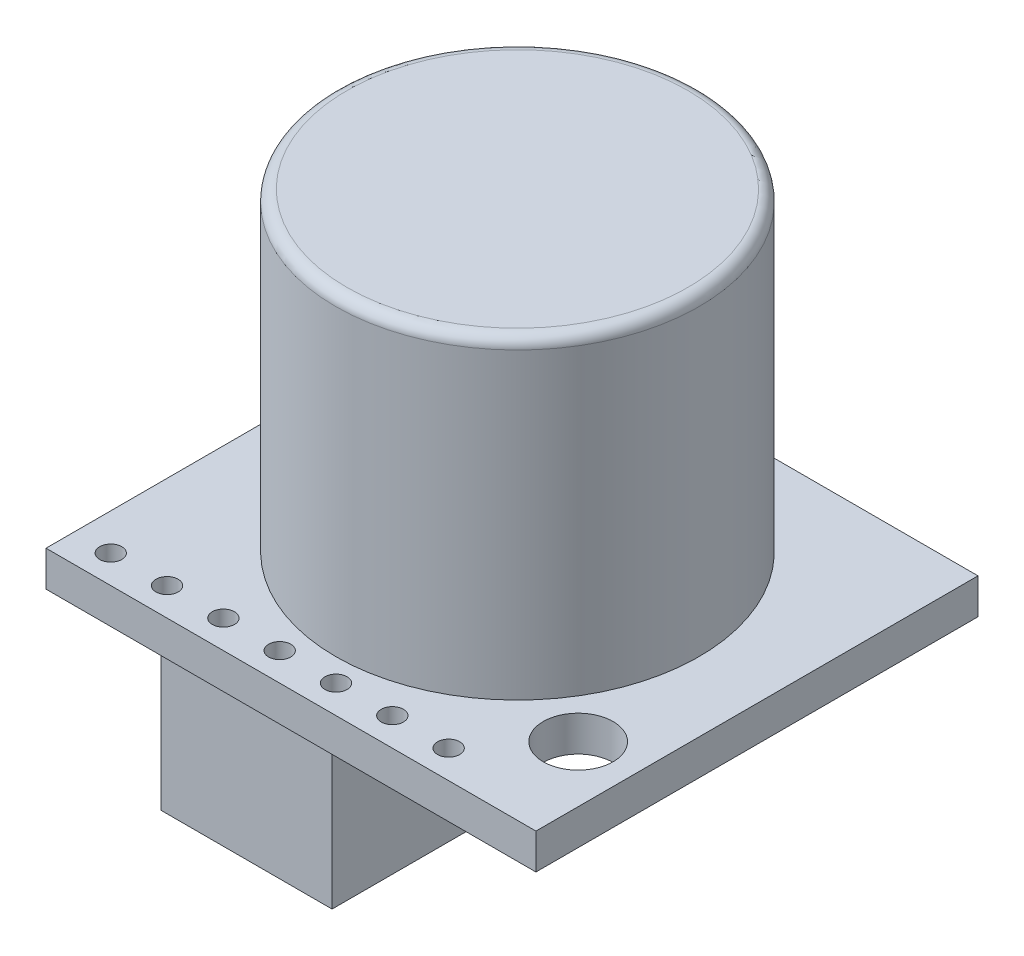
ISO-10303-21;
HEADER;
FILE_DESCRIPTION(('STEP AP214'),'2;1');
FILE_NAME('part.step','',(''),(''),'','','');
FILE_SCHEMA(('AUTOMOTIVE_DESIGN { 1 0 10303 214 1 1 1 1 }'));
ENDSEC;
DATA;
#1=APPLICATION_CONTEXT('core data for automotive mechanical design processes');
#2=APPLICATION_PROTOCOL_DEFINITION('international standard','automotive_design',2000,#1);
#3=PRODUCT_CONTEXT('',#1,'mechanical');
#4=PRODUCT('Part','Part','',(#3));
#5=PRODUCT_RELATED_PRODUCT_CATEGORY('part','',(#4));
#6=PRODUCT_DEFINITION_FORMATION('','',#4);
#7=PRODUCT_DEFINITION_CONTEXT('part definition',#1,'design');
#8=PRODUCT_DEFINITION('design','',#6,#7);
#9=PRODUCT_DEFINITION_SHAPE('','',#8);
#10=(LENGTH_UNIT() NAMED_UNIT(*) SI_UNIT(.MILLI.,.METRE.));
#11=(NAMED_UNIT(*) PLANE_ANGLE_UNIT() SI_UNIT($,.RADIAN.));
#12=(NAMED_UNIT(*) SI_UNIT($,.STERADIAN.) SOLID_ANGLE_UNIT());
#13=UNCERTAINTY_MEASURE_WITH_UNIT(LENGTH_MEASURE(1.E-05),#10,'distance_accuracy_value','');
#14=(GEOMETRIC_REPRESENTATION_CONTEXT(3) GLOBAL_UNCERTAINTY_ASSIGNED_CONTEXT((#13)) GLOBAL_UNIT_ASSIGNED_CONTEXT((#10,
#11,#12)) REPRESENTATION_CONTEXT('',''));
#15=CARTESIAN_POINT('',(0.,0.,0.));
#16=DIRECTION('',(0.,0.,1.));
#17=DIRECTION('',(1.,0.,0.));
#18=AXIS2_PLACEMENT_3D('',#15,#16,#17);
#19=CARTESIAN_POINT('',(0.,1.6002,0.));
#20=DIRECTION('',(0.,1.,0.));
#21=DIRECTION('',(0.,0.,1.));
#22=AXIS2_PLACEMENT_3D('',#19,#20,#21);
#23=PLANE('',#22);
#24=DIRECTION('',(1.,0.,0.));
#25=VECTOR('',#24,1.);
#26=CARTESIAN_POINT('',(0.,1.6002,0.));
#27=LINE('',#26,#25);
#28=CARTESIAN_POINT('',(0.,1.6002,0.));
#29=VERTEX_POINT('',#28);
#30=CARTESIAN_POINT('',(22.098,1.6002,0.));
#31=VERTEX_POINT('',#30);
#32=EDGE_CURVE('E166',#29,#31,#27,.T.);
#33=ORIENTED_EDGE('',*,*,#32,.T.);
#34=DIRECTION('',(0.,0.,-1.));
#35=VECTOR('',#34,1.);
#36=CARTESIAN_POINT('',(22.098,1.6002,0.));
#37=LINE('',#36,#35);
#38=CARTESIAN_POINT('',(22.098,1.6002,-19.939));
#39=VERTEX_POINT('',#38);
#40=EDGE_CURVE('E169',#31,#39,#37,.T.);
#41=ORIENTED_EDGE('',*,*,#40,.T.);
#42=DIRECTION('',(1.,0.,0.));
#43=VECTOR('',#42,1.);
#44=CARTESIAN_POINT('',(0.,1.6002,-19.939));
#45=LINE('',#44,#43);
#46=CARTESIAN_POINT('',(0.,1.6002,-19.939));
#47=VERTEX_POINT('',#46);
#48=EDGE_CURVE('E171',#47,#39,#45,.T.);
#49=ORIENTED_EDGE('',*,*,#48,.F.);
#50=DIRECTION('',(0.,0.,-1.));
#51=VECTOR('',#50,1.);
#52=CARTESIAN_POINT('',(0.,1.6002,0.));
#53=LINE('',#52,#51);
#54=EDGE_CURVE('E174',#29,#47,#53,.T.);
#55=ORIENTED_EDGE('',*,*,#54,.F.);
#56=EDGE_LOOP('',(#33,#41,#49,#55));
#57=FACE_BOUND('',#56,.T.);
#58=CARTESIAN_POINT('',(2.54,1.6002,-17.399));
#59=DIRECTION('',(0.,1.,0.));
#60=DIRECTION('',(0.,0.,1.));
#61=AXIS2_PLACEMENT_3D('',#58,#59,#60);
#62=CIRCLE('',#61,1.5748);
#63=CARTESIAN_POINT('',(2.54,1.6002,-15.8242));
#64=VERTEX_POINT('',#63);
#65=EDGE_CURVE('E163',#64,#64,#62,.T.);
#66=ORIENTED_EDGE('',*,*,#65,.F.);
#67=EDGE_LOOP('',(#66));
#68=FACE_BOUND('',#67,.T.);
#69=CARTESIAN_POINT('',(19.558,1.6002,-4.445));
#70=DIRECTION('',(0.,1.,0.));
#71=DIRECTION('',(0.,0.,1.));
#72=AXIS2_PLACEMENT_3D('',#69,#70,#71);
#73=CIRCLE('',#72,1.5748);
#74=CARTESIAN_POINT('',(19.558,1.6002,-2.8702));
#75=VERTEX_POINT('',#74);
#76=EDGE_CURVE('E160',#75,#75,#73,.T.);
#77=ORIENTED_EDGE('',*,*,#76,.F.);
#78=EDGE_LOOP('',(#77));
#79=FACE_BOUND('',#78,.T.);
#80=CARTESIAN_POINT('',(1.651,1.6002,-1.27));
#81=DIRECTION('',(0.,1.,0.));
#82=DIRECTION('',(0.,0.,1.));
#83=AXIS2_PLACEMENT_3D('',#80,#81,#82);
#84=CIRCLE('',#83,0.5);
#85=CARTESIAN_POINT('',(1.651,1.6002,-0.770000000000004));
#86=VERTEX_POINT('',#85);
#87=EDGE_CURVE('E157',#86,#86,#84,.T.);
#88=ORIENTED_EDGE('',*,*,#87,.F.);
#89=EDGE_LOOP('',(#88));
#90=FACE_BOUND('',#89,.T.);
#91=CARTESIAN_POINT('',(4.191,1.6002,-1.27));
#92=DIRECTION('',(0.,1.,0.));
#93=DIRECTION('',(0.,0.,1.));
#94=AXIS2_PLACEMENT_3D('',#91,#92,#93);
#95=CIRCLE('',#94,0.500000000000001);
#96=CARTESIAN_POINT('',(4.191,1.6002,-0.770000000000003));
#97=VERTEX_POINT('',#96);
#98=EDGE_CURVE('E154',#97,#97,#95,.T.);
#99=ORIENTED_EDGE('',*,*,#98,.F.);
#100=EDGE_LOOP('',(#99));
#101=FACE_BOUND('',#100,.T.);
#102=CARTESIAN_POINT('',(6.731,1.6002,-1.27));
#103=DIRECTION('',(0.,1.,0.));
#104=DIRECTION('',(0.,0.,1.));
#105=AXIS2_PLACEMENT_3D('',#102,#103,#104);
#106=CIRCLE('',#105,0.500000000000001);
#107=CARTESIAN_POINT('',(6.731,1.6002,-0.770000000000003));
#108=VERTEX_POINT('',#107);
#109=EDGE_CURVE('E151',#108,#108,#106,.T.);
#110=ORIENTED_EDGE('',*,*,#109,.F.);
#111=EDGE_LOOP('',(#110));
#112=FACE_BOUND('',#111,.T.);
#113=CARTESIAN_POINT('',(9.271,1.6002,-1.27));
#114=DIRECTION('',(0.,1.,0.));
#115=DIRECTION('',(0.,0.,1.));
#116=AXIS2_PLACEMENT_3D('',#113,#114,#115);
#117=CIRCLE('',#116,0.500000000000001);
#118=CARTESIAN_POINT('',(9.271,1.6002,-0.770000000000003));
#119=VERTEX_POINT('',#118);
#120=EDGE_CURVE('E148',#119,#119,#117,.T.);
#121=ORIENTED_EDGE('',*,*,#120,.F.);
#122=EDGE_LOOP('',(#121));
#123=FACE_BOUND('',#122,.T.);
#124=CARTESIAN_POINT('',(11.811,1.6002,-1.27));
#125=DIRECTION('',(0.,1.,0.));
#126=DIRECTION('',(0.,0.,1.));
#127=AXIS2_PLACEMENT_3D('',#124,#125,#126);
#128=CIRCLE('',#127,0.500000000000001);
#129=CARTESIAN_POINT('',(11.811,1.6002,-0.770000000000003));
#130=VERTEX_POINT('',#129);
#131=EDGE_CURVE('E145',#130,#130,#128,.T.);
#132=ORIENTED_EDGE('',*,*,#131,.F.);
#133=EDGE_LOOP('',(#132));
#134=FACE_BOUND('',#133,.T.);
#135=CARTESIAN_POINT('',(14.351,1.6002,-1.27));
#136=DIRECTION('',(0.,1.,0.));
#137=DIRECTION('',(0.,0.,1.));
#138=AXIS2_PLACEMENT_3D('',#135,#136,#137);
#139=CIRCLE('',#138,0.500000000000001);
#140=CARTESIAN_POINT('',(14.351,1.6002,-0.770000000000003));
#141=VERTEX_POINT('',#140);
#142=EDGE_CURVE('E141',#141,#141,#139,.T.);
#143=ORIENTED_EDGE('',*,*,#142,.F.);
#144=EDGE_LOOP('',(#143));
#145=FACE_BOUND('',#144,.T.);
#146=CARTESIAN_POINT('',(16.891,1.6002,-1.27));
#147=DIRECTION('',(0.,1.,0.));
#148=DIRECTION('',(0.,0.,1.));
#149=AXIS2_PLACEMENT_3D('',#146,#147,#148);
#150=CIRCLE('',#149,0.499999999999999);
#151=CARTESIAN_POINT('',(16.891,1.6002,-0.770000000000005));
#152=VERTEX_POINT('',#151);
#153=EDGE_CURVE('E138',#152,#152,#150,.T.);
#154=ORIENTED_EDGE('',*,*,#153,.F.);
#155=EDGE_LOOP('',(#154));
#156=FACE_BOUND('',#155,.T.);
#157=CARTESIAN_POINT('',(10.7741203925044,1.6002,-10.4902));
#158=DIRECTION('',(0.,1.,0.));
#159=DIRECTION('',(0.,0.,1.));
#160=AXIS2_PLACEMENT_3D('',#157,#158,#159);
#161=CIRCLE('',#160,8.1915);
#162=CARTESIAN_POINT('',(10.7741203925044,1.6002,-2.2987));
#163=VERTEX_POINT('',#162);
#164=EDGE_CURVE('E125',#163,#163,#161,.F.);
#165=ORIENTED_EDGE('',*,*,#164,.T.);
#166=EDGE_LOOP('',(#165));
#167=FACE_BOUND('',#166,.T.);
#168=ADVANCED_FACE('F33',(#57,#68,#79,#90,#101,#112,#123,#134,#145,#156,#167),#23,.T.);
#169=CARTESIAN_POINT('',(0.,1.6002,0.));
#170=DIRECTION('',(0.,0.,-1.));
#171=DIRECTION('',(-1.,0.,0.));
#172=AXIS2_PLACEMENT_3D('',#169,#170,#171);
#173=PLANE('',#172);
#174=DIRECTION('',(1.,0.,0.));
#175=VECTOR('',#174,1.);
#176=CARTESIAN_POINT('',(0.,0.,0.));
#177=LINE('',#176,#175);
#178=CARTESIAN_POINT('',(0.,0.,0.));
#179=VERTEX_POINT('',#178);
#180=CARTESIAN_POINT('',(22.098,0.,0.));
#181=VERTEX_POINT('',#180);
#182=EDGE_CURVE('E204',#179,#181,#177,.T.);
#183=ORIENTED_EDGE('',*,*,#182,.T.);
#184=DIRECTION('',(0.,-1.,0.));
#185=VECTOR('',#184,1.);
#186=CARTESIAN_POINT('',(22.098,1.6002,0.));
#187=LINE('',#186,#185);
#188=EDGE_CURVE('E220',#31,#181,#187,.T.);
#189=ORIENTED_EDGE('',*,*,#188,.F.);
#190=ORIENTED_EDGE('',*,*,#32,.F.);
#191=DIRECTION('',(0.,-1.,0.));
#192=VECTOR('',#191,1.);
#193=CARTESIAN_POINT('',(0.,1.6002,0.));
#194=LINE('',#193,#192);
#195=EDGE_CURVE('E177',#29,#179,#194,.T.);
#196=ORIENTED_EDGE('',*,*,#195,.T.);
#197=EDGE_LOOP('',(#183,#189,#190,#196));
#198=FACE_BOUND('',#197,.T.);
#199=ADVANCED_FACE('F236',(#198),#173,.F.);
#200=CARTESIAN_POINT('',(22.098,1.6002,0.));
#201=DIRECTION('',(-1.,0.,0.));
#202=DIRECTION('',(0.,0.,1.));
#203=AXIS2_PLACEMENT_3D('',#200,#201,#202);
#204=PLANE('',#203);
#205=DIRECTION('',(0.,0.,-1.));
#206=VECTOR('',#205,1.);
#207=CARTESIAN_POINT('',(22.098,0.,0.));
#208=LINE('',#207,#206);
#209=CARTESIAN_POINT('',(22.098,0.,-19.939));
#210=VERTEX_POINT('',#209);
#211=EDGE_CURVE('E207',#181,#210,#208,.T.);
#212=ORIENTED_EDGE('',*,*,#211,.T.);
#213=DIRECTION('',(0.,-1.,0.));
#214=VECTOR('',#213,1.);
#215=CARTESIAN_POINT('',(22.098,1.6002,-19.939));
#216=LINE('',#215,#214);
#217=EDGE_CURVE('E218',#39,#210,#216,.T.);
#218=ORIENTED_EDGE('',*,*,#217,.F.);
#219=ORIENTED_EDGE('',*,*,#40,.F.);
#220=ORIENTED_EDGE('',*,*,#188,.T.);
#221=EDGE_LOOP('',(#212,#218,#219,#220));
#222=FACE_BOUND('',#221,.T.);
#223=ADVANCED_FACE('F242',(#222),#204,.F.);
#224=CARTESIAN_POINT('',(0.,1.6002,-19.939));
#225=DIRECTION('',(0.,0.,-1.));
#226=DIRECTION('',(-1.,0.,0.));
#227=AXIS2_PLACEMENT_3D('',#224,#225,#226);
#228=PLANE('',#227);
#229=DIRECTION('',(1.,0.,0.));
#230=VECTOR('',#229,1.);
#231=CARTESIAN_POINT('',(0.,0.,-19.939));
#232=LINE('',#231,#230);
#233=CARTESIAN_POINT('',(0.,0.,-19.939));
#234=VERTEX_POINT('',#233);
#235=EDGE_CURVE('E210',#234,#210,#232,.T.);
#236=ORIENTED_EDGE('',*,*,#235,.F.);
#237=DIRECTION('',(0.,-1.,0.));
#238=VECTOR('',#237,1.);
#239=CARTESIAN_POINT('',(0.,1.6002,-19.939));
#240=LINE('',#239,#238);
#241=EDGE_CURVE('E216',#47,#234,#240,.T.);
#242=ORIENTED_EDGE('',*,*,#241,.F.);
#243=ORIENTED_EDGE('',*,*,#48,.T.);
#244=ORIENTED_EDGE('',*,*,#217,.T.);
#245=EDGE_LOOP('',(#236,#242,#243,#244));
#246=FACE_BOUND('',#245,.T.);
#247=ADVANCED_FACE('F257',(#246),#228,.T.);
#248=CARTESIAN_POINT('',(2.54,1.6002,-17.399));
#249=DIRECTION('',(0.,-1.,0.));
#250=DIRECTION('',(0.,0.,-1.));
#251=AXIS2_PLACEMENT_3D('',#248,#249,#250);
#252=CYLINDRICAL_SURFACE('',#251,1.5748);
#253=ORIENTED_EDGE('',*,*,#65,.T.);
#254=EDGE_LOOP('',(#253));
#255=FACE_BOUND('',#254,.T.);
#256=CARTESIAN_POINT('',(2.54,0.,-17.399));
#257=DIRECTION('',(0.,1.,0.));
#258=DIRECTION('',(0.,0.,1.));
#259=AXIS2_PLACEMENT_3D('',#256,#257,#258);
#260=CIRCLE('',#259,1.5748);
#261=CARTESIAN_POINT('',(2.54,0.,-15.8242));
#262=VERTEX_POINT('',#261);
#263=EDGE_CURVE('E201',#262,#262,#260,.T.);
#264=ORIENTED_EDGE('',*,*,#263,.F.);
#265=EDGE_LOOP('',(#264));
#266=FACE_BOUND('',#265,.T.);
#267=ADVANCED_FACE('F260',(#255,#266),#252,.F.);
#268=CARTESIAN_POINT('',(19.558,1.6002,-4.445));
#269=DIRECTION('',(0.,-1.,0.));
#270=DIRECTION('',(0.,0.,-1.));
#271=AXIS2_PLACEMENT_3D('',#268,#269,#270);
#272=CYLINDRICAL_SURFACE('',#271,1.5748);
#273=ORIENTED_EDGE('',*,*,#76,.T.);
#274=EDGE_LOOP('',(#273));
#275=FACE_BOUND('',#274,.T.);
#276=CARTESIAN_POINT('',(19.558,0.,-4.445));
#277=DIRECTION('',(0.,1.,0.));
#278=DIRECTION('',(0.,0.,1.));
#279=AXIS2_PLACEMENT_3D('',#276,#277,#278);
#280=CIRCLE('',#279,1.5748);
#281=CARTESIAN_POINT('',(19.558,0.,-2.8702));
#282=VERTEX_POINT('',#281);
#283=EDGE_CURVE('E198',#282,#282,#280,.T.);
#284=ORIENTED_EDGE('',*,*,#283,.F.);
#285=EDGE_LOOP('',(#284));
#286=FACE_BOUND('',#285,.T.);
#287=ADVANCED_FACE('F267',(#275,#286),#272,.F.);
#288=CARTESIAN_POINT('',(1.651,1.6002,-1.27));
#289=DIRECTION('',(0.,-1.,0.));
#290=DIRECTION('',(0.,0.,-1.));
#291=AXIS2_PLACEMENT_3D('',#288,#289,#290);
#292=CYLINDRICAL_SURFACE('',#291,0.5);
#293=ORIENTED_EDGE('',*,*,#87,.T.);
#294=EDGE_LOOP('',(#293));
#295=FACE_BOUND('',#294,.T.);
#296=CARTESIAN_POINT('',(1.651,0.,-1.27));
#297=DIRECTION('',(0.,1.,0.));
#298=DIRECTION('',(0.,0.,1.));
#299=AXIS2_PLACEMENT_3D('',#296,#297,#298);
#300=CIRCLE('',#299,0.5);
#301=CARTESIAN_POINT('',(1.651,0.,-0.770000000000004));
#302=VERTEX_POINT('',#301);
#303=EDGE_CURVE('E195',#302,#302,#300,.T.);
#304=ORIENTED_EDGE('',*,*,#303,.F.);
#305=EDGE_LOOP('',(#304));
#306=FACE_BOUND('',#305,.T.);
#307=ADVANCED_FACE('F271',(#295,#306),#292,.F.);
#308=CARTESIAN_POINT('',(4.191,1.6002,-1.27));
#309=DIRECTION('',(0.,-1.,0.));
#310=DIRECTION('',(0.,0.,-1.));
#311=AXIS2_PLACEMENT_3D('',#308,#309,#310);
#312=CYLINDRICAL_SURFACE('',#311,0.500000000000001);
#313=ORIENTED_EDGE('',*,*,#98,.T.);
#314=EDGE_LOOP('',(#313));
#315=FACE_BOUND('',#314,.T.);
#316=CARTESIAN_POINT('',(4.191,0.,-1.27));
#317=DIRECTION('',(0.,1.,0.));
#318=DIRECTION('',(0.,0.,1.));
#319=AXIS2_PLACEMENT_3D('',#316,#317,#318);
#320=CIRCLE('',#319,0.500000000000001);
#321=CARTESIAN_POINT('',(4.191,0.,-0.770000000000003));
#322=VERTEX_POINT('',#321);
#323=EDGE_CURVE('E192',#322,#322,#320,.T.);
#324=ORIENTED_EDGE('',*,*,#323,.F.);
#325=EDGE_LOOP('',(#324));
#326=FACE_BOUND('',#325,.T.);
#327=ADVANCED_FACE('F275',(#315,#326),#312,.F.);
#328=CARTESIAN_POINT('',(6.731,1.6002,-1.27));
#329=DIRECTION('',(0.,-1.,0.));
#330=DIRECTION('',(0.,0.,-1.));
#331=AXIS2_PLACEMENT_3D('',#328,#329,#330);
#332=CYLINDRICAL_SURFACE('',#331,0.500000000000001);
#333=ORIENTED_EDGE('',*,*,#109,.T.);
#334=EDGE_LOOP('',(#333));
#335=FACE_BOUND('',#334,.T.);
#336=CARTESIAN_POINT('',(6.731,0.,-1.27));
#337=DIRECTION('',(0.,1.,0.));
#338=DIRECTION('',(0.,0.,1.));
#339=AXIS2_PLACEMENT_3D('',#336,#337,#338);
#340=CIRCLE('',#339,0.500000000000001);
#341=CARTESIAN_POINT('',(6.731,0.,-0.770000000000003));
#342=VERTEX_POINT('',#341);
#343=EDGE_CURVE('E189',#342,#342,#340,.T.);
#344=ORIENTED_EDGE('',*,*,#343,.F.);
#345=EDGE_LOOP('',(#344));
#346=FACE_BOUND('',#345,.T.);
#347=ADVANCED_FACE('F279',(#335,#346),#332,.F.);
#348=CARTESIAN_POINT('',(9.271,1.6002,-1.27));
#349=DIRECTION('',(0.,-1.,0.));
#350=DIRECTION('',(0.,0.,-1.));
#351=AXIS2_PLACEMENT_3D('',#348,#349,#350);
#352=CYLINDRICAL_SURFACE('',#351,0.500000000000001);
#353=ORIENTED_EDGE('',*,*,#120,.T.);
#354=EDGE_LOOP('',(#353));
#355=FACE_BOUND('',#354,.T.);
#356=CARTESIAN_POINT('',(9.271,0.,-1.27));
#357=DIRECTION('',(0.,1.,0.));
#358=DIRECTION('',(0.,0.,1.));
#359=AXIS2_PLACEMENT_3D('',#356,#357,#358);
#360=CIRCLE('',#359,0.500000000000001);
#361=CARTESIAN_POINT('',(9.271,0.,-0.770000000000003));
#362=VERTEX_POINT('',#361);
#363=EDGE_CURVE('E186',#362,#362,#360,.T.);
#364=ORIENTED_EDGE('',*,*,#363,.F.);
#365=EDGE_LOOP('',(#364));
#366=FACE_BOUND('',#365,.T.);
#367=ADVANCED_FACE('F283',(#355,#366),#352,.F.);
#368=CARTESIAN_POINT('',(11.811,1.6002,-1.27));
#369=DIRECTION('',(0.,-1.,0.));
#370=DIRECTION('',(0.,0.,-1.));
#371=AXIS2_PLACEMENT_3D('',#368,#369,#370);
#372=CYLINDRICAL_SURFACE('',#371,0.500000000000001);
#373=ORIENTED_EDGE('',*,*,#131,.T.);
#374=EDGE_LOOP('',(#373));
#375=FACE_BOUND('',#374,.T.);
#376=CARTESIAN_POINT('',(11.811,0.,-1.27));
#377=DIRECTION('',(0.,1.,0.));
#378=DIRECTION('',(0.,0.,1.));
#379=AXIS2_PLACEMENT_3D('',#376,#377,#378);
#380=CIRCLE('',#379,0.500000000000001);
#381=CARTESIAN_POINT('',(11.811,0.,-0.770000000000003));
#382=VERTEX_POINT('',#381);
#383=EDGE_CURVE('E183',#382,#382,#380,.T.);
#384=ORIENTED_EDGE('',*,*,#383,.F.);
#385=EDGE_LOOP('',(#384));
#386=FACE_BOUND('',#385,.T.);
#387=ADVANCED_FACE('F287',(#375,#386),#372,.F.);
#388=CARTESIAN_POINT('',(14.351,1.6002,-1.27));
#389=DIRECTION('',(0.,-1.,0.));
#390=DIRECTION('',(0.,0.,-1.));
#391=AXIS2_PLACEMENT_3D('',#388,#389,#390);
#392=CYLINDRICAL_SURFACE('',#391,0.500000000000001);
#393=ORIENTED_EDGE('',*,*,#142,.T.);
#394=EDGE_LOOP('',(#393));
#395=FACE_BOUND('',#394,.T.);
#396=CARTESIAN_POINT('',(14.351,0.,-1.27));
#397=DIRECTION('',(0.,1.,0.));
#398=DIRECTION('',(0.,0.,1.));
#399=AXIS2_PLACEMENT_3D('',#396,#397,#398);
#400=CIRCLE('',#399,0.500000000000001);
#401=CARTESIAN_POINT('',(14.351,0.,-0.770000000000003));
#402=VERTEX_POINT('',#401);
#403=EDGE_CURVE('E180',#402,#402,#400,.T.);
#404=ORIENTED_EDGE('',*,*,#403,.F.);
#405=EDGE_LOOP('',(#404));
#406=FACE_BOUND('',#405,.T.);
#407=ADVANCED_FACE('F291',(#395,#406),#392,.F.);
#408=CARTESIAN_POINT('',(16.891,1.6002,-1.27));
#409=DIRECTION('',(0.,-1.,0.));
#410=DIRECTION('',(0.,0.,-1.));
#411=AXIS2_PLACEMENT_3D('',#408,#409,#410);
#412=CYLINDRICAL_SURFACE('',#411,0.499999999999999);
#413=ORIENTED_EDGE('',*,*,#153,.T.);
#414=EDGE_LOOP('',(#413));
#415=FACE_BOUND('',#414,.T.);
#416=CARTESIAN_POINT('',(16.891,0.,-1.27));
#417=DIRECTION('',(0.,1.,0.));
#418=DIRECTION('',(0.,0.,1.));
#419=AXIS2_PLACEMENT_3D('',#416,#417,#418);
#420=CIRCLE('',#419,0.499999999999999);
#421=CARTESIAN_POINT('',(16.891,0.,-0.770000000000005));
#422=VERTEX_POINT('',#421);
#423=EDGE_CURVE('E134',#422,#422,#420,.T.);
#424=ORIENTED_EDGE('',*,*,#423,.F.);
#425=EDGE_LOOP('',(#424));
#426=FACE_BOUND('',#425,.T.);
#427=ADVANCED_FACE('F255',(#415,#426),#412,.F.);
#428=CARTESIAN_POINT('',(0.,1.6002,0.));
#429=DIRECTION('',(-1.,0.,0.));
#430=DIRECTION('',(0.,0.,1.));
#431=AXIS2_PLACEMENT_3D('',#428,#429,#430);
#432=PLANE('',#431);
#433=DIRECTION('',(0.,0.,-1.));
#434=VECTOR('',#433,1.);
#435=CARTESIAN_POINT('',(0.,0.,0.));
#436=LINE('',#435,#434);
#437=EDGE_CURVE('E142',#179,#234,#436,.T.);
#438=ORIENTED_EDGE('',*,*,#437,.F.);
#439=ORIENTED_EDGE('',*,*,#195,.F.);
#440=ORIENTED_EDGE('',*,*,#54,.T.);
#441=ORIENTED_EDGE('',*,*,#241,.T.);
#442=EDGE_LOOP('',(#438,#439,#440,#441));
#443=FACE_BOUND('',#442,.T.);
#444=ADVANCED_FACE('F252',(#443),#432,.T.);
#445=CARTESIAN_POINT('',(0.,0.,0.));
#446=DIRECTION('',(0.,1.,0.));
#447=DIRECTION('',(0.,0.,1.));
#448=AXIS2_PLACEMENT_3D('',#445,#446,#447);
#449=PLANE('',#448);
#450=DIRECTION('',(0.,0.,1.));
#451=VECTOR('',#450,1.);
#452=CARTESIAN_POINT('',(9.6012,0.,0.));
#453=LINE('',#452,#451);
#454=CARTESIAN_POINT('',(9.6012,0.,-11.0236));
#455=VERTEX_POINT('',#454);
#456=CARTESIAN_POINT('',(9.6012,0.,-3.302));
#457=VERTEX_POINT('',#456);
#458=EDGE_CURVE('E114',#455,#457,#453,.T.);
#459=ORIENTED_EDGE('',*,*,#458,.F.);
#460=DIRECTION('',(1.,0.,0.));
#461=VECTOR('',#460,1.);
#462=CARTESIAN_POINT('',(0.,0.,-11.0236));
#463=LINE('',#462,#461);
#464=CARTESIAN_POINT('',(1.8796,0.,-11.0236));
#465=VERTEX_POINT('',#464);
#466=EDGE_CURVE('E53',#465,#455,#463,.T.);
#467=ORIENTED_EDGE('',*,*,#466,.F.);
#468=DIRECTION('',(0.,0.,1.));
#469=VECTOR('',#468,1.);
#470=CARTESIAN_POINT('',(1.8796,0.,0.));
#471=LINE('',#470,#469);
#472=CARTESIAN_POINT('',(1.8796,0.,-3.302));
#473=VERTEX_POINT('',#472);
#474=EDGE_CURVE('E48',#465,#473,#471,.T.);
#475=ORIENTED_EDGE('',*,*,#474,.T.);
#476=DIRECTION('',(1.,0.,0.));
#477=VECTOR('',#476,1.);
#478=CARTESIAN_POINT('',(0.,0.,-3.302));
#479=LINE('',#478,#477);
#480=EDGE_CURVE('E129',#473,#457,#479,.T.);
#481=ORIENTED_EDGE('',*,*,#480,.T.);
#482=EDGE_LOOP('',(#459,#467,#475,#481));
#483=FACE_BOUND('',#482,.T.);
#484=ORIENTED_EDGE('',*,*,#182,.F.);
#485=ORIENTED_EDGE('',*,*,#437,.T.);
#486=ORIENTED_EDGE('',*,*,#235,.T.);
#487=ORIENTED_EDGE('',*,*,#211,.F.);
#488=EDGE_LOOP('',(#484,#485,#486,#487));
#489=FACE_BOUND('',#488,.T.);
#490=ORIENTED_EDGE('',*,*,#263,.T.);
#491=EDGE_LOOP('',(#490));
#492=FACE_BOUND('',#491,.T.);
#493=ORIENTED_EDGE('',*,*,#283,.T.);
#494=EDGE_LOOP('',(#493));
#495=FACE_BOUND('',#494,.T.);
#496=ORIENTED_EDGE('',*,*,#303,.T.);
#497=EDGE_LOOP('',(#496));
#498=FACE_BOUND('',#497,.T.);
#499=ORIENTED_EDGE('',*,*,#323,.T.);
#500=EDGE_LOOP('',(#499));
#501=FACE_BOUND('',#500,.T.);
#502=ORIENTED_EDGE('',*,*,#343,.T.);
#503=EDGE_LOOP('',(#502));
#504=FACE_BOUND('',#503,.T.);
#505=ORIENTED_EDGE('',*,*,#363,.T.);
#506=EDGE_LOOP('',(#505));
#507=FACE_BOUND('',#506,.T.);
#508=ORIENTED_EDGE('',*,*,#383,.T.);
#509=EDGE_LOOP('',(#508));
#510=FACE_BOUND('',#509,.T.);
#511=ORIENTED_EDGE('',*,*,#403,.T.);
#512=EDGE_LOOP('',(#511));
#513=FACE_BOUND('',#512,.T.);
#514=ORIENTED_EDGE('',*,*,#423,.T.);
#515=EDGE_LOOP('',(#514));
#516=FACE_BOUND('',#515,.T.);
#517=ADVANCED_FACE('F249',(#483,#489,#492,#495,#498,#501,#504,#507,#510,#513,#516),#449,.F.);
#518=CARTESIAN_POINT('',(0.,-9.3472,-3.302));
#519=DIRECTION('',(0.,0.,1.));
#520=DIRECTION('',(1.,0.,0.));
#521=AXIS2_PLACEMENT_3D('',#518,#519,#520);
#522=PLANE('',#521);
#523=ORIENTED_EDGE('',*,*,#480,.F.);
#524=DIRECTION('',(0.,1.,0.));
#525=VECTOR('',#524,1.);
#526=CARTESIAN_POINT('',(1.8796,-9.3472,-3.302));
#527=LINE('',#526,#525);
#528=CARTESIAN_POINT('',(1.8796,-9.3472,-3.302));
#529=VERTEX_POINT('',#528);
#530=EDGE_CURVE('E121',#529,#473,#527,.T.);
#531=ORIENTED_EDGE('',*,*,#530,.F.);
#532=DIRECTION('',(1.,0.,0.));
#533=VECTOR('',#532,1.);
#534=CARTESIAN_POINT('',(0.,-9.3472,-3.302));
#535=LINE('',#534,#533);
#536=CARTESIAN_POINT('',(9.6012,-9.3472,-3.302));
#537=VERTEX_POINT('',#536);
#538=EDGE_CURVE('E102',#529,#537,#535,.T.);
#539=ORIENTED_EDGE('',*,*,#538,.T.);
#540=DIRECTION('',(0.,1.,0.));
#541=VECTOR('',#540,1.);
#542=CARTESIAN_POINT('',(9.6012,-9.3472,-3.302));
#543=LINE('',#542,#541);
#544=EDGE_CURVE('E112',#537,#457,#543,.T.);
#545=ORIENTED_EDGE('',*,*,#544,.T.);
#546=EDGE_LOOP('',(#523,#531,#539,#545));
#547=FACE_BOUND('',#546,.T.);
#548=ADVANCED_FACE('F120',(#547),#522,.T.);
#549=CARTESIAN_POINT('',(1.8796,-9.3472,0.));
#550=DIRECTION('',(-1.,0.,0.));
#551=DIRECTION('',(0.,0.,1.));
#552=AXIS2_PLACEMENT_3D('',#549,#550,#551);
#553=PLANE('',#552);
#554=ORIENTED_EDGE('',*,*,#474,.F.);
#555=DIRECTION('',(0.,1.,0.));
#556=VECTOR('',#555,1.);
#557=CARTESIAN_POINT('',(1.8796,-9.3472,-11.0236));
#558=LINE('',#557,#556);
#559=CARTESIAN_POINT('',(1.8796,-9.3472,-11.0236));
#560=VERTEX_POINT('',#559);
#561=EDGE_CURVE('E135',#560,#465,#558,.T.);
#562=ORIENTED_EDGE('',*,*,#561,.F.);
#563=DIRECTION('',(0.,0.,1.));
#564=VECTOR('',#563,1.);
#565=CARTESIAN_POINT('',(1.8796,-9.3472,0.));
#566=LINE('',#565,#564);
#567=EDGE_CURVE('E118',#560,#529,#566,.T.);
#568=ORIENTED_EDGE('',*,*,#567,.T.);
#569=ORIENTED_EDGE('',*,*,#530,.T.);
#570=EDGE_LOOP('',(#554,#562,#568,#569));
#571=FACE_BOUND('',#570,.T.);
#572=ADVANCED_FACE('F316',(#571),#553,.T.);
#573=CARTESIAN_POINT('',(0.,-9.3472,-11.0236));
#574=DIRECTION('',(0.,0.,1.));
#575=DIRECTION('',(1.,0.,0.));
#576=AXIS2_PLACEMENT_3D('',#573,#574,#575);
#577=PLANE('',#576);
#578=ORIENTED_EDGE('',*,*,#466,.T.);
#579=DIRECTION('',(0.,1.,0.));
#580=VECTOR('',#579,1.);
#581=CARTESIAN_POINT('',(9.6012,-9.3472,-11.0236));
#582=LINE('',#581,#580);
#583=CARTESIAN_POINT('',(9.6012,-9.3472,-11.0236));
#584=VERTEX_POINT('',#583);
#585=EDGE_CURVE('E117',#584,#455,#582,.T.);
#586=ORIENTED_EDGE('',*,*,#585,.F.);
#587=DIRECTION('',(1.,0.,0.));
#588=VECTOR('',#587,1.);
#589=CARTESIAN_POINT('',(0.,-9.3472,-11.0236));
#590=LINE('',#589,#588);
#591=EDGE_CURVE('E105',#560,#584,#590,.T.);
#592=ORIENTED_EDGE('',*,*,#591,.F.);
#593=ORIENTED_EDGE('',*,*,#561,.T.);
#594=EDGE_LOOP('',(#578,#586,#592,#593));
#595=FACE_BOUND('',#594,.T.);
#596=ADVANCED_FACE('F319',(#595),#577,.F.);
#597=CARTESIAN_POINT('',(9.6012,-9.3472,0.));
#598=DIRECTION('',(-1.,0.,0.));
#599=DIRECTION('',(0.,0.,1.));
#600=AXIS2_PLACEMENT_3D('',#597,#598,#599);
#601=PLANE('',#600);
#602=ORIENTED_EDGE('',*,*,#458,.T.);
#603=ORIENTED_EDGE('',*,*,#544,.F.);
#604=DIRECTION('',(0.,0.,1.));
#605=VECTOR('',#604,1.);
#606=CARTESIAN_POINT('',(9.6012,-9.3472,0.));
#607=LINE('',#606,#605);
#608=EDGE_CURVE('E97',#584,#537,#607,.T.);
#609=ORIENTED_EDGE('',*,*,#608,.F.);
#610=ORIENTED_EDGE('',*,*,#585,.T.);
#611=EDGE_LOOP('',(#602,#603,#609,#610));
#612=FACE_BOUND('',#611,.T.);
#613=ADVANCED_FACE('F113',(#612),#601,.F.);
#614=CARTESIAN_POINT('',(0.,-9.3472,0.));
#615=DIRECTION('',(0.,1.,0.));
#616=DIRECTION('',(0.,0.,1.));
#617=AXIS2_PLACEMENT_3D('',#614,#615,#616);
#618=PLANE('',#617);
#619=ORIENTED_EDGE('',*,*,#538,.F.);
#620=ORIENTED_EDGE('',*,*,#567,.F.);
#621=ORIENTED_EDGE('',*,*,#591,.T.);
#622=ORIENTED_EDGE('',*,*,#608,.T.);
#623=EDGE_LOOP('',(#619,#620,#621,#622));
#624=FACE_BOUND('',#623,.T.);
#625=ADVANCED_FACE('F99',(#624),#618,.F.);
#626=CARTESIAN_POINT('',(10.7741203925044,15.7734,-10.4902));
#627=DIRECTION('',(0.,-1.,0.));
#628=DIRECTION('',(0.,0.,-1.));
#629=AXIS2_PLACEMENT_3D('',#626,#627,#628);
#630=CYLINDRICAL_SURFACE('',#629,8.1915);
#631=CARTESIAN_POINT('',(10.7741203925044,15.2734,-10.4902));
#632=DIRECTION('',(0.,1.,0.));
#633=DIRECTION('',(0.,0.,1.));
#634=AXIS2_PLACEMENT_3D('',#631,#632,#633);
#635=CIRCLE('',#634,8.1915);
#636=CARTESIAN_POINT('',(10.7741203925044,15.2734,-2.2987));
#637=VERTEX_POINT('',#636);
#638=EDGE_CURVE('E11',#637,#637,#635,.F.);
#639=ORIENTED_EDGE('',*,*,#638,.T.);
#640=EDGE_LOOP('',(#639));
#641=FACE_BOUND('',#640,.T.);
#642=ORIENTED_EDGE('',*,*,#164,.F.);
#643=EDGE_LOOP('',(#642));
#644=FACE_BOUND('',#643,.T.);
#645=ADVANCED_FACE('F232',(#641,#644),#630,.T.);
#646=CARTESIAN_POINT('',(0.,15.7734,0.));
#647=DIRECTION('',(0.,1.,0.));
#648=DIRECTION('',(0.,0.,1.));
#649=AXIS2_PLACEMENT_3D('',#646,#647,#648);
#650=PLANE('',#649);
#651=CARTESIAN_POINT('',(10.7741203925044,15.7734,-10.4902));
#652=DIRECTION('',(0.,1.,0.));
#653=DIRECTION('',(0.,0.,1.));
#654=AXIS2_PLACEMENT_3D('',#651,#652,#653);
#655=CIRCLE('',#654,7.6915);
#656=CARTESIAN_POINT('',(10.7741203925044,15.7734,-2.7987));
#657=VERTEX_POINT('',#656);
#658=EDGE_CURVE('E41',#657,#657,#655,.T.);
#659=ORIENTED_EDGE('',*,*,#658,.T.);
#660=EDGE_LOOP('',(#659));
#661=FACE_BOUND('',#660,.T.);
#662=ADVANCED_FACE('F225',(#661),#650,.T.);
#663=CARTESIAN_POINT('',(10.7741203925044,15.2734,-10.4902));
#664=DIRECTION('',(0.,1.,0.));
#665=DIRECTION('',(0.,0.,1.));
#666=AXIS2_PLACEMENT_3D('',#663,#664,#665);
#667=TOROIDAL_SURFACE('',#666,7.6915,0.5);
#668=ORIENTED_EDGE('',*,*,#638,.F.);
#669=EDGE_LOOP('',(#668));
#670=FACE_BOUND('',#669,.T.);
#671=ORIENTED_EDGE('',*,*,#658,.F.);
#672=EDGE_LOOP('',(#671));
#673=FACE_BOUND('',#672,.T.);
#674=ADVANCED_FACE('F35',(#670,#673),#667,.T.);
#675=CLOSED_SHELL('',(#168,#199,#223,#247,#267,#287,#307,#327,#347,#367,#387,#407,#427,#444,
#517,#548,#572,#596,#613,#625,#645,#662,#674));
#676=MANIFOLD_SOLID_BREP('B2',#675);
#677=ADVANCED_BREP_SHAPE_REPRESENTATION('',(#18,#676),#14);
#678=SHAPE_DEFINITION_REPRESENTATION(#9,#677);
ENDSEC;
END-ISO-10303-21;
